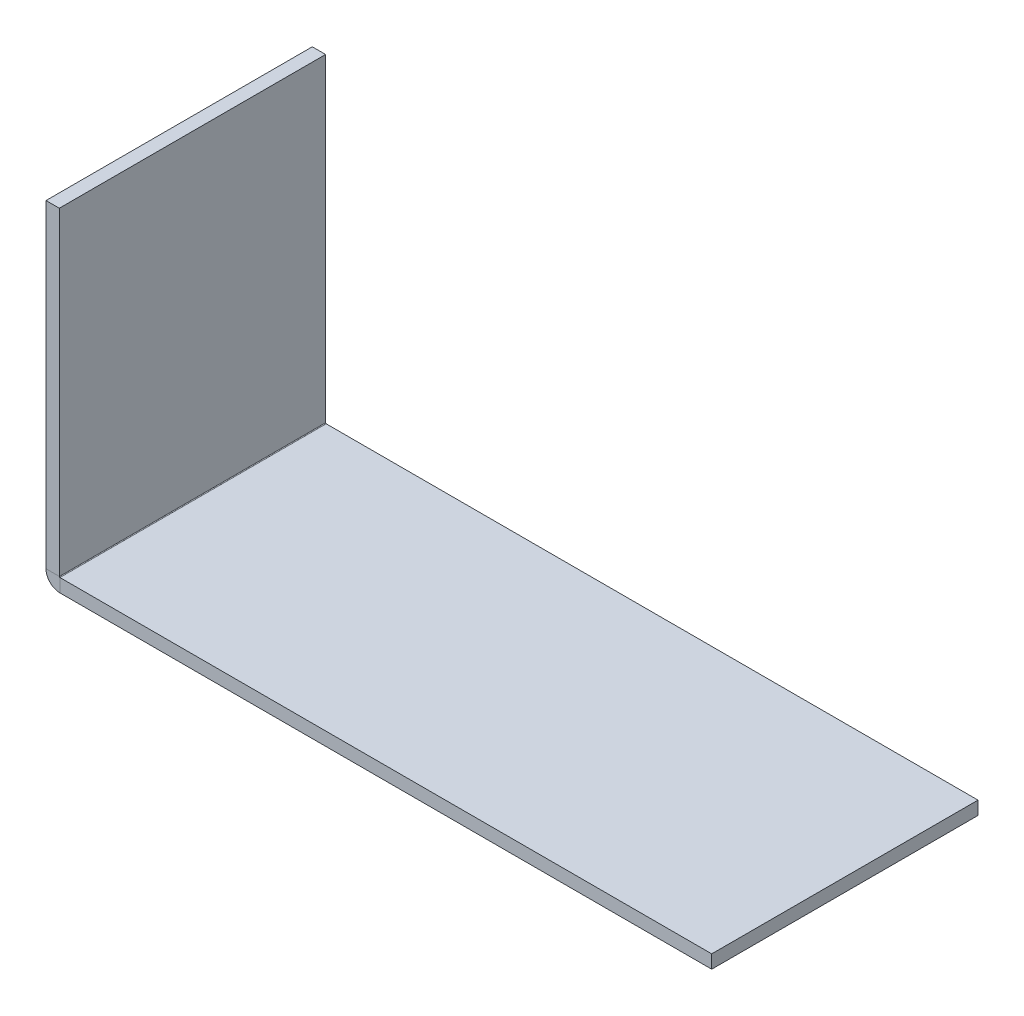
ISO-10303-21;
HEADER;
FILE_DESCRIPTION(('STEP AP214'),'2;1');
FILE_NAME('part.step','',(''),(''),'','','');
FILE_SCHEMA(('AUTOMOTIVE_DESIGN { 1 0 10303 214 1 1 1 1 }'));
ENDSEC;
DATA;
#1=APPLICATION_CONTEXT('core data for automotive mechanical design processes');
#2=APPLICATION_PROTOCOL_DEFINITION('international standard','automotive_design',2000,#1);
#3=PRODUCT_CONTEXT('',#1,'mechanical');
#4=PRODUCT('Part','Part','',(#3));
#5=PRODUCT_RELATED_PRODUCT_CATEGORY('part','',(#4));
#6=PRODUCT_DEFINITION_FORMATION('','',#4);
#7=PRODUCT_DEFINITION_CONTEXT('part definition',#1,'design');
#8=PRODUCT_DEFINITION('design','',#6,#7);
#9=PRODUCT_DEFINITION_SHAPE('','',#8);
#10=(LENGTH_UNIT() NAMED_UNIT(*) SI_UNIT(.MILLI.,.METRE.));
#11=(NAMED_UNIT(*) PLANE_ANGLE_UNIT() SI_UNIT($,.RADIAN.));
#12=(NAMED_UNIT(*) SI_UNIT($,.STERADIAN.) SOLID_ANGLE_UNIT());
#13=UNCERTAINTY_MEASURE_WITH_UNIT(LENGTH_MEASURE(1.E-05),#10,'distance_accuracy_value','');
#14=(GEOMETRIC_REPRESENTATION_CONTEXT(3) GLOBAL_UNCERTAINTY_ASSIGNED_CONTEXT((#13)) GLOBAL_UNIT_ASSIGNED_CONTEXT((#10,
#11,#12)) REPRESENTATION_CONTEXT('',''));
#15=CARTESIAN_POINT('',(0.,0.,0.));
#16=DIRECTION('',(0.,0.,1.));
#17=DIRECTION('',(1.,0.,0.));
#18=AXIS2_PLACEMENT_3D('',#15,#16,#17);
#19=CARTESIAN_POINT('',(2.1,0.,-40.));
#20=DIRECTION('',(0.,0.,-1.));
#21=DIRECTION('',(-1.,0.,0.));
#22=AXIS2_PLACEMENT_3D('',#19,#20,#21);
#23=PLANE('',#22);
#24=DIRECTION('',(0.,1.,0.));
#25=VECTOR('',#24,1.);
#26=CARTESIAN_POINT('',(2.1,0.,-40.));
#27=LINE('',#26,#25);
#28=CARTESIAN_POINT('',(2.1,0.,-40.));
#29=VERTEX_POINT('',#28);
#30=CARTESIAN_POINT('',(2.1,2.,-40.));
#31=VERTEX_POINT('',#30);
#32=EDGE_CURVE('E11',#29,#31,#27,.T.);
#33=ORIENTED_EDGE('',*,*,#32,.F.);
#34=CARTESIAN_POINT('',(2.1,2.1,-40.));
#35=DIRECTION('',(0.,0.,-1.));
#36=DIRECTION('',(-1.,0.,0.));
#37=AXIS2_PLACEMENT_3D('',#34,#35,#36);
#38=CIRCLE('',#37,2.1);
#39=CARTESIAN_POINT('',(0.,2.1,-40.));
#40=VERTEX_POINT('',#39);
#41=EDGE_CURVE('E142',#40,#29,#38,.F.);
#42=ORIENTED_EDGE('',*,*,#41,.F.);
#43=DIRECTION('',(-1.,0.,0.));
#44=VECTOR('',#43,1.);
#45=CARTESIAN_POINT('',(2.,2.1,-40.));
#46=LINE('',#45,#44);
#47=CARTESIAN_POINT('',(2.,2.1,-40.));
#48=VERTEX_POINT('',#47);
#49=EDGE_CURVE('E50',#48,#40,#46,.T.);
#50=ORIENTED_EDGE('',*,*,#49,.F.);
#51=CARTESIAN_POINT('',(2.1,2.1,-40.));
#52=DIRECTION('',(0.,0.,1.));
#53=DIRECTION('',(1.,0.,0.));
#54=AXIS2_PLACEMENT_3D('',#51,#52,#53);
#55=CIRCLE('',#54,0.0999999999999998);
#56=EDGE_CURVE('E213',#48,#31,#55,.T.);
#57=ORIENTED_EDGE('',*,*,#56,.T.);
#58=EDGE_LOOP('',(#33,#42,#50,#57));
#59=FACE_BOUND('',#58,.T.);
#60=ADVANCED_FACE('F41',(#59),#23,.T.);
#61=CARTESIAN_POINT('',(2.,2.1,-40.));
#62=DIRECTION('',(0.,0.,-1.));
#63=DIRECTION('',(-1.,0.,0.));
#64=AXIS2_PLACEMENT_3D('',#61,#62,#63);
#65=PLANE('',#64);
#66=DIRECTION('',(1.,0.,0.));
#67=VECTOR('',#66,1.);
#68=CARTESIAN_POINT('',(0.,0.,-40.));
#69=LINE('',#68,#67);
#70=CARTESIAN_POINT('',(100.,0.,-40.));
#71=VERTEX_POINT('',#70);
#72=EDGE_CURVE('E176',#29,#71,#69,.T.);
#73=ORIENTED_EDGE('',*,*,#72,.F.);
#74=ORIENTED_EDGE('',*,*,#32,.T.);
#75=DIRECTION('',(1.,0.,0.));
#76=VECTOR('',#75,1.);
#77=CARTESIAN_POINT('',(0.,2.,-40.));
#78=LINE('',#77,#76);
#79=CARTESIAN_POINT('',(100.,2.,-40.));
#80=VERTEX_POINT('',#79);
#81=EDGE_CURVE('E229',#31,#80,#78,.T.);
#82=ORIENTED_EDGE('',*,*,#81,.T.);
#83=DIRECTION('',(0.,-1.,0.));
#84=VECTOR('',#83,1.);
#85=CARTESIAN_POINT('',(100.,2.,-40.));
#86=LINE('',#85,#84);
#87=EDGE_CURVE('E101',#80,#71,#86,.T.);
#88=ORIENTED_EDGE('',*,*,#87,.T.);
#89=EDGE_LOOP('',(#73,#74,#82,#88));
#90=FACE_BOUND('',#89,.T.);
#91=ADVANCED_FACE('F239',(#90),#65,.T.);
#92=CARTESIAN_POINT('',(0.,2.1,0.));
#93=DIRECTION('',(0.,0.,1.));
#94=DIRECTION('',(1.,0.,0.));
#95=AXIS2_PLACEMENT_3D('',#92,#93,#94);
#96=PLANE('',#95);
#97=DIRECTION('',(1.,0.,0.));
#98=VECTOR('',#97,1.);
#99=CARTESIAN_POINT('',(0.,2.1,0.));
#100=LINE('',#99,#98);
#101=CARTESIAN_POINT('',(0.,2.1,0.));
#102=VERTEX_POINT('',#101);
#103=CARTESIAN_POINT('',(2.,2.1,0.));
#104=VERTEX_POINT('',#103);
#105=EDGE_CURVE('E85',#102,#104,#100,.T.);
#106=ORIENTED_EDGE('',*,*,#105,.F.);
#107=CARTESIAN_POINT('',(2.1,2.1,0.));
#108=DIRECTION('',(0.,0.,-1.));
#109=DIRECTION('',(-1.,0.,0.));
#110=AXIS2_PLACEMENT_3D('',#107,#108,#109);
#111=CIRCLE('',#110,2.1);
#112=CARTESIAN_POINT('',(2.1,0.,0.));
#113=VERTEX_POINT('',#112);
#114=EDGE_CURVE('E173',#102,#113,#111,.F.);
#115=ORIENTED_EDGE('',*,*,#114,.T.);
#116=DIRECTION('',(0.,-1.,0.));
#117=VECTOR('',#116,1.);
#118=CARTESIAN_POINT('',(2.1,2.,0.));
#119=LINE('',#118,#117);
#120=CARTESIAN_POINT('',(2.1,2.,0.));
#121=VERTEX_POINT('',#120);
#122=EDGE_CURVE('E92',#121,#113,#119,.T.);
#123=ORIENTED_EDGE('',*,*,#122,.F.);
#124=CARTESIAN_POINT('',(2.1,2.1,0.));
#125=DIRECTION('',(0.,0.,1.));
#126=DIRECTION('',(1.,0.,0.));
#127=AXIS2_PLACEMENT_3D('',#124,#125,#126);
#128=CIRCLE('',#127,0.0999999999999998);
#129=EDGE_CURVE('E160',#104,#121,#128,.T.);
#130=ORIENTED_EDGE('',*,*,#129,.F.);
#131=EDGE_LOOP('',(#106,#115,#123,#130));
#132=FACE_BOUND('',#131,.T.);
#133=ADVANCED_FACE('F214',(#132),#96,.T.);
#134=CARTESIAN_POINT('',(2.1,2.,0.));
#135=DIRECTION('',(0.,0.,1.));
#136=DIRECTION('',(1.,0.,0.));
#137=AXIS2_PLACEMENT_3D('',#134,#135,#136);
#138=PLANE('',#137);
#139=DIRECTION('',(0.,-1.,0.));
#140=VECTOR('',#139,1.);
#141=CARTESIAN_POINT('',(0.,50.,0.));
#142=LINE('',#141,#140);
#143=CARTESIAN_POINT('',(0.,50.,0.));
#144=VERTEX_POINT('',#143);
#145=EDGE_CURVE('E122',#144,#102,#142,.T.);
#146=ORIENTED_EDGE('',*,*,#145,.T.);
#147=ORIENTED_EDGE('',*,*,#105,.T.);
#148=DIRECTION('',(0.,1.,0.));
#149=VECTOR('',#148,1.);
#150=CARTESIAN_POINT('',(2.,50.,0.));
#151=LINE('',#150,#149);
#152=CARTESIAN_POINT('',(2.,50.,0.));
#153=VERTEX_POINT('',#152);
#154=EDGE_CURVE('E164',#153,#104,#151,.F.);
#155=ORIENTED_EDGE('',*,*,#154,.F.);
#156=DIRECTION('',(1.,0.,0.));
#157=VECTOR('',#156,1.);
#158=CARTESIAN_POINT('',(0.,50.,0.));
#159=LINE('',#158,#157);
#160=EDGE_CURVE('E168',#144,#153,#159,.T.);
#161=ORIENTED_EDGE('',*,*,#160,.F.);
#162=EDGE_LOOP('',(#146,#147,#155,#161));
#163=FACE_BOUND('',#162,.T.);
#164=ADVANCED_FACE('F204',(#163),#138,.T.);
#165=CARTESIAN_POINT('',(0.,0.,-40.));
#166=DIRECTION('',(0.,-1.,0.));
#167=DIRECTION('',(0.,0.,-1.));
#168=AXIS2_PLACEMENT_3D('',#165,#166,#167);
#169=PLANE('',#168);
#170=DIRECTION('',(1.,0.,0.));
#171=VECTOR('',#170,1.);
#172=CARTESIAN_POINT('',(0.,0.,0.));
#173=LINE('',#172,#171);
#174=CARTESIAN_POINT('',(100.,0.,0.));
#175=VERTEX_POINT('',#174);
#176=EDGE_CURVE('E150',#113,#175,#173,.T.);
#177=ORIENTED_EDGE('',*,*,#176,.F.);
#178=DIRECTION('',(0.,0.,1.));
#179=VECTOR('',#178,1.);
#180=CARTESIAN_POINT('',(2.1,0.,-40.));
#181=LINE('',#180,#179);
#182=EDGE_CURVE('E177',#29,#113,#181,.T.);
#183=ORIENTED_EDGE('',*,*,#182,.F.);
#184=ORIENTED_EDGE('',*,*,#72,.T.);
#185=DIRECTION('',(0.,0.,1.));
#186=VECTOR('',#185,1.);
#187=CARTESIAN_POINT('',(100.,0.,-40.));
#188=LINE('',#187,#186);
#189=EDGE_CURVE('E146',#71,#175,#188,.T.);
#190=ORIENTED_EDGE('',*,*,#189,.T.);
#191=EDGE_LOOP('',(#177,#183,#184,#190));
#192=FACE_BOUND('',#191,.T.);
#193=ADVANCED_FACE('F220',(#192),#169,.T.);
#194=CARTESIAN_POINT('',(2.1,2.1,-40.));
#195=DIRECTION('',(0.,0.,1.));
#196=DIRECTION('',(1.,0.,0.));
#197=AXIS2_PLACEMENT_3D('',#194,#195,#196);
#198=CYLINDRICAL_SURFACE('',#197,2.1);
#199=ORIENTED_EDGE('',*,*,#114,.F.);
#200=DIRECTION('',(0.,0.,1.));
#201=VECTOR('',#200,1.);
#202=CARTESIAN_POINT('',(0.,2.1,-40.));
#203=LINE('',#202,#201);
#204=EDGE_CURVE('E126',#40,#102,#203,.T.);
#205=ORIENTED_EDGE('',*,*,#204,.F.);
#206=ORIENTED_EDGE('',*,*,#41,.T.);
#207=ORIENTED_EDGE('',*,*,#182,.T.);
#208=EDGE_LOOP('',(#199,#205,#206,#207));
#209=FACE_BOUND('',#208,.T.);
#210=ADVANCED_FACE('F216',(#209),#198,.T.);
#211=CARTESIAN_POINT('',(0.,50.,-40.));
#212=DIRECTION('',(-1.,0.,0.));
#213=DIRECTION('',(0.,0.,1.));
#214=AXIS2_PLACEMENT_3D('',#211,#212,#213);
#215=PLANE('',#214);
#216=ORIENTED_EDGE('',*,*,#145,.F.);
#217=DIRECTION('',(0.,0.,1.));
#218=VECTOR('',#217,1.);
#219=CARTESIAN_POINT('',(0.,50.,-40.));
#220=LINE('',#219,#218);
#221=CARTESIAN_POINT('',(0.,50.,-40.));
#222=VERTEX_POINT('',#221);
#223=EDGE_CURVE('E116',#222,#144,#220,.T.);
#224=ORIENTED_EDGE('',*,*,#223,.F.);
#225=DIRECTION('',(0.,-1.,0.));
#226=VECTOR('',#225,1.);
#227=CARTESIAN_POINT('',(0.,50.,-40.));
#228=LINE('',#227,#226);
#229=EDGE_CURVE('E120',#222,#40,#228,.T.);
#230=ORIENTED_EDGE('',*,*,#229,.T.);
#231=ORIENTED_EDGE('',*,*,#204,.T.);
#232=EDGE_LOOP('',(#216,#224,#230,#231));
#233=FACE_BOUND('',#232,.T.);
#234=ADVANCED_FACE('F118',(#233),#215,.T.);
#235=CARTESIAN_POINT('',(0.,50.,-40.));
#236=DIRECTION('',(0.,-1.,0.));
#237=DIRECTION('',(0.,0.,-1.));
#238=AXIS2_PLACEMENT_3D('',#235,#236,#237);
#239=PLANE('',#238);
#240=ORIENTED_EDGE('',*,*,#160,.T.);
#241=DIRECTION('',(0.,0.,1.));
#242=VECTOR('',#241,1.);
#243=CARTESIAN_POINT('',(2.,50.,-40.));
#244=LINE('',#243,#242);
#245=CARTESIAN_POINT('',(2.,50.,-40.));
#246=VERTEX_POINT('',#245);
#247=EDGE_CURVE('E127',#246,#153,#244,.T.);
#248=ORIENTED_EDGE('',*,*,#247,.F.);
#249=DIRECTION('',(1.,0.,0.));
#250=VECTOR('',#249,1.);
#251=CARTESIAN_POINT('',(0.,50.,-40.));
#252=LINE('',#251,#250);
#253=EDGE_CURVE('E130',#222,#246,#252,.T.);
#254=ORIENTED_EDGE('',*,*,#253,.F.);
#255=ORIENTED_EDGE('',*,*,#223,.T.);
#256=EDGE_LOOP('',(#240,#248,#254,#255));
#257=FACE_BOUND('',#256,.T.);
#258=ADVANCED_FACE('F131',(#257),#239,.F.);
#259=CARTESIAN_POINT('',(2.,50.,-40.));
#260=DIRECTION('',(-1.,0.,0.));
#261=DIRECTION('',(0.,0.,1.));
#262=AXIS2_PLACEMENT_3D('',#259,#260,#261);
#263=PLANE('',#262);
#264=ORIENTED_EDGE('',*,*,#154,.T.);
#265=DIRECTION('',(0.,0.,1.));
#266=VECTOR('',#265,1.);
#267=CARTESIAN_POINT('',(2.,2.1,-40.));
#268=LINE('',#267,#266);
#269=EDGE_CURVE('E184',#48,#104,#268,.T.);
#270=ORIENTED_EDGE('',*,*,#269,.F.);
#271=DIRECTION('',(0.,1.,0.));
#272=VECTOR('',#271,1.);
#273=CARTESIAN_POINT('',(2.,50.,-40.));
#274=LINE('',#273,#272);
#275=EDGE_CURVE('E137',#246,#48,#274,.F.);
#276=ORIENTED_EDGE('',*,*,#275,.F.);
#277=ORIENTED_EDGE('',*,*,#247,.T.);
#278=EDGE_LOOP('',(#264,#270,#276,#277));
#279=FACE_BOUND('',#278,.T.);
#280=ADVANCED_FACE('F208',(#279),#263,.F.);
#281=CARTESIAN_POINT('',(2.1,2.1,-40.));
#282=DIRECTION('',(0.,0.,1.));
#283=DIRECTION('',(1.,0.,0.));
#284=AXIS2_PLACEMENT_3D('',#281,#282,#283);
#285=CYLINDRICAL_SURFACE('',#284,0.0999999999999998);
#286=ORIENTED_EDGE('',*,*,#129,.T.);
#287=DIRECTION('',(0.,0.,1.));
#288=VECTOR('',#287,1.);
#289=CARTESIAN_POINT('',(2.1,2.,-40.));
#290=LINE('',#289,#288);
#291=EDGE_CURVE('E188',#31,#121,#290,.T.);
#292=ORIENTED_EDGE('',*,*,#291,.F.);
#293=ORIENTED_EDGE('',*,*,#56,.F.);
#294=ORIENTED_EDGE('',*,*,#269,.T.);
#295=EDGE_LOOP('',(#286,#292,#293,#294));
#296=FACE_BOUND('',#295,.T.);
#297=ADVANCED_FACE('F211',(#296),#285,.F.);
#298=CARTESIAN_POINT('',(0.,2.,-40.));
#299=DIRECTION('',(0.,-1.,0.));
#300=DIRECTION('',(0.,0.,-1.));
#301=AXIS2_PLACEMENT_3D('',#298,#299,#300);
#302=PLANE('',#301);
#303=DIRECTION('',(1.,0.,0.));
#304=VECTOR('',#303,1.);
#305=CARTESIAN_POINT('',(0.,2.,0.));
#306=LINE('',#305,#304);
#307=CARTESIAN_POINT('',(100.,2.,0.));
#308=VERTEX_POINT('',#307);
#309=EDGE_CURVE('E157',#121,#308,#306,.T.);
#310=ORIENTED_EDGE('',*,*,#309,.T.);
#311=DIRECTION('',(0.,0.,1.));
#312=VECTOR('',#311,1.);
#313=CARTESIAN_POINT('',(100.,2.,-40.));
#314=LINE('',#313,#312);
#315=EDGE_CURVE('E192',#80,#308,#314,.T.);
#316=ORIENTED_EDGE('',*,*,#315,.F.);
#317=ORIENTED_EDGE('',*,*,#81,.F.);
#318=ORIENTED_EDGE('',*,*,#291,.T.);
#319=EDGE_LOOP('',(#310,#316,#317,#318));
#320=FACE_BOUND('',#319,.T.);
#321=ADVANCED_FACE('F228',(#320),#302,.F.);
#322=CARTESIAN_POINT('',(100.,2.,-40.));
#323=DIRECTION('',(-1.,0.,0.));
#324=DIRECTION('',(0.,0.,1.));
#325=AXIS2_PLACEMENT_3D('',#322,#323,#324);
#326=PLANE('',#325);
#327=DIRECTION('',(0.,-1.,0.));
#328=VECTOR('',#327,1.);
#329=CARTESIAN_POINT('',(100.,2.,0.));
#330=LINE('',#329,#328);
#331=EDGE_CURVE('E153',#308,#175,#330,.T.);
#332=ORIENTED_EDGE('',*,*,#331,.T.);
#333=ORIENTED_EDGE('',*,*,#189,.F.);
#334=ORIENTED_EDGE('',*,*,#87,.F.);
#335=ORIENTED_EDGE('',*,*,#315,.T.);
#336=EDGE_LOOP('',(#332,#333,#334,#335));
#337=FACE_BOUND('',#336,.T.);
#338=ADVANCED_FACE('F224',(#337),#326,.F.);
#339=CARTESIAN_POINT('',(2.1,2.1,-40.));
#340=DIRECTION('',(0.,0.,1.));
#341=DIRECTION('',(1.,0.,0.));
#342=AXIS2_PLACEMENT_3D('',#339,#340,#341);
#343=PLANE('',#342);
#344=ORIENTED_EDGE('',*,*,#275,.T.);
#345=ORIENTED_EDGE('',*,*,#49,.T.);
#346=ORIENTED_EDGE('',*,*,#229,.F.);
#347=ORIENTED_EDGE('',*,*,#253,.T.);
#348=EDGE_LOOP('',(#344,#345,#346,#347));
#349=FACE_BOUND('',#348,.T.);
#350=ADVANCED_FACE('F139',(#349),#343,.F.);
#351=CARTESIAN_POINT('',(2.1,2.1,0.));
#352=DIRECTION('',(0.,0.,1.));
#353=DIRECTION('',(1.,0.,0.));
#354=AXIS2_PLACEMENT_3D('',#351,#352,#353);
#355=PLANE('',#354);
#356=ORIENTED_EDGE('',*,*,#176,.T.);
#357=ORIENTED_EDGE('',*,*,#331,.F.);
#358=ORIENTED_EDGE('',*,*,#309,.F.);
#359=ORIENTED_EDGE('',*,*,#122,.T.);
#360=EDGE_LOOP('',(#356,#357,#358,#359));
#361=FACE_BOUND('',#360,.T.);
#362=ADVANCED_FACE('F222',(#361),#355,.T.);
#363=CLOSED_SHELL('',(#60,#91,#133,#164,#193,#210,#234,#258,#280,#297,#321,#338,#350,#362));
#364=MANIFOLD_SOLID_BREP('B2',#363);
#365=ADVANCED_BREP_SHAPE_REPRESENTATION('',(#18,#364),#14);
#366=SHAPE_DEFINITION_REPRESENTATION(#9,#365);
ENDSEC;
END-ISO-10303-21;
